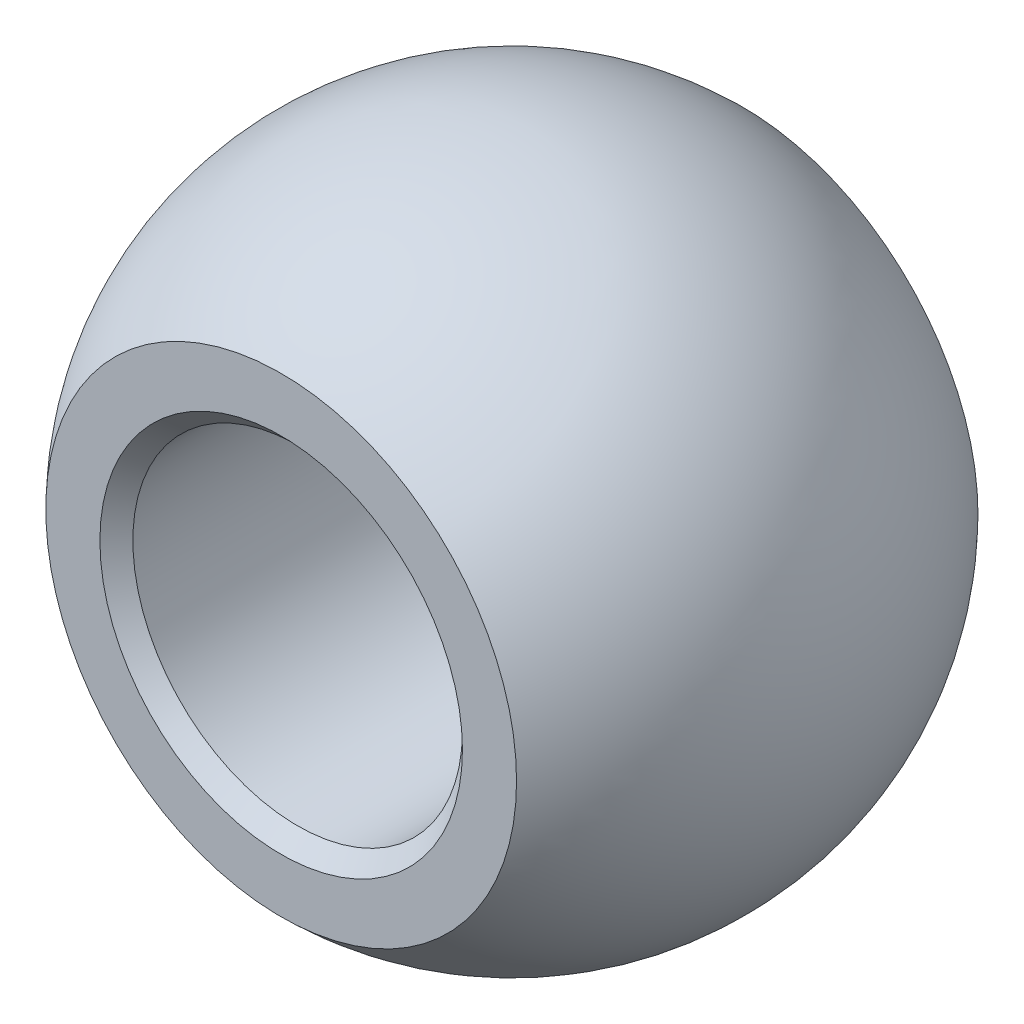
ISO-10303-21;
HEADER;
FILE_DESCRIPTION(('STEP AP214'),'2;1');
FILE_NAME('part.step','',(''),(''),'','','');
FILE_SCHEMA(('AUTOMOTIVE_DESIGN { 1 0 10303 214 1 1 1 1 }'));
ENDSEC;
DATA;
#1=APPLICATION_CONTEXT('core data for automotive mechanical design processes');
#2=APPLICATION_PROTOCOL_DEFINITION('international standard','automotive_design',2000,#1);
#3=PRODUCT_CONTEXT('',#1,'mechanical');
#4=PRODUCT('Part','Part','',(#3));
#5=PRODUCT_RELATED_PRODUCT_CATEGORY('part','',(#4));
#6=PRODUCT_DEFINITION_FORMATION('','',#4);
#7=PRODUCT_DEFINITION_CONTEXT('part definition',#1,'design');
#8=PRODUCT_DEFINITION('design','',#6,#7);
#9=PRODUCT_DEFINITION_SHAPE('','',#8);
#10=(LENGTH_UNIT() NAMED_UNIT(*) SI_UNIT(.MILLI.,.METRE.));
#11=(NAMED_UNIT(*) PLANE_ANGLE_UNIT() SI_UNIT($,.RADIAN.));
#12=(NAMED_UNIT(*) SI_UNIT($,.STERADIAN.) SOLID_ANGLE_UNIT());
#13=UNCERTAINTY_MEASURE_WITH_UNIT(LENGTH_MEASURE(1.E-05),#10,'distance_accuracy_value','');
#14=(GEOMETRIC_REPRESENTATION_CONTEXT(3) GLOBAL_UNCERTAINTY_ASSIGNED_CONTEXT((#13)) GLOBAL_UNIT_ASSIGNED_CONTEXT((#10,
#11,#12)) REPRESENTATION_CONTEXT('',''));
#15=CARTESIAN_POINT('',(0.,0.,0.));
#16=DIRECTION('',(0.,0.,1.));
#17=DIRECTION('',(1.,0.,0.));
#18=AXIS2_PLACEMENT_3D('',#15,#16,#17);
#19=CARTESIAN_POINT('',(0.,15.875,0.));
#20=DIRECTION('',(0.,-1.,0.));
#21=DIRECTION('',(1.,0.,0.));
#22=AXIS2_PLACEMENT_3D('',#19,#20,#21);
#23=SPHERICAL_SURFACE('',#22,7.9375);
#24=CARTESIAN_POINT('',(0.,15.875,0.));
#25=DIRECTION('',(0.,0.,1.));
#26=DIRECTION('',(1.,0.,0.));
#27=AXIS2_PLACEMENT_3D('',#24,#25,#26);
#28=SPHERICAL_SURFACE('',#27,7.9375);
#29=CARTESIAN_POINT('',(0.,15.875,-5.55625));
#30=DIRECTION('',(0.,0.,1.));
#31=DIRECTION('',(1.,0.,0.));
#32=AXIS2_PLACEMENT_3D('',#29,#30,#31);
#33=CIRCLE('',#32,5.66850881515589);
#34=CARTESIAN_POINT('',(5.66850881515589,15.875,-5.55625));
#35=VERTEX_POINT('',#34);
#36=EDGE_CURVE('E61',#35,#35,#33,.F.);
#37=ORIENTED_EDGE('',*,*,#36,.F.);
#38=EDGE_LOOP('',(#37));
#39=FACE_BOUND('',#38,.T.);
#40=CARTESIAN_POINT('',(0.,15.875,5.55625));
#41=DIRECTION('',(0.,0.,1.));
#42=DIRECTION('',(1.,0.,0.));
#43=AXIS2_PLACEMENT_3D('',#40,#41,#42);
#44=CIRCLE('',#43,5.66850881515589);
#45=CARTESIAN_POINT('',(5.66850881515589,15.875,5.55625));
#46=VERTEX_POINT('',#45);
#47=EDGE_CURVE('E64',#46,#46,#44,.F.);
#48=ORIENTED_EDGE('',*,*,#47,.T.);
#49=EDGE_LOOP('',(#48));
#50=FACE_BOUND('',#49,.T.);
#51=ADVANCED_FACE('F41',(#39,#50),#28,.T.);
#52=CARTESIAN_POINT('',(0.,15.875,-7.9375));
#53=DIRECTION('',(0.,0.,1.));
#54=DIRECTION('',(1.,0.,0.));
#55=AXIS2_PLACEMENT_3D('',#52,#53,#54);
#56=CYLINDRICAL_SURFACE('',#55,3.96875);
#57=CARTESIAN_POINT('',(0.,15.875,-5.15937500000001));
#58=DIRECTION('',(0.,0.,1.));
#59=DIRECTION('',(1.,0.,0.));
#60=AXIS2_PLACEMENT_3D('',#57,#58,#59);
#61=CIRCLE('',#60,3.96875);
#62=CARTESIAN_POINT('',(3.96875,15.875,-5.15937500000001));
#63=VERTEX_POINT('',#62);
#64=EDGE_CURVE('E52',#63,#63,#61,.F.);
#65=ORIENTED_EDGE('',*,*,#64,.T.);
#66=EDGE_LOOP('',(#65));
#67=FACE_BOUND('',#66,.T.);
#68=CARTESIAN_POINT('',(0.,15.875,5.159375));
#69=DIRECTION('',(0.,0.,1.));
#70=DIRECTION('',(1.,0.,0.));
#71=AXIS2_PLACEMENT_3D('',#68,#69,#70);
#72=CIRCLE('',#71,3.96875);
#73=CARTESIAN_POINT('',(3.96875,15.875,5.159375));
#74=VERTEX_POINT('',#73);
#75=EDGE_CURVE('E56',#74,#74,#72,.T.);
#76=ORIENTED_EDGE('',*,*,#75,.T.);
#77=EDGE_LOOP('',(#76));
#78=FACE_BOUND('',#77,.T.);
#79=ADVANCED_FACE('F79',(#67,#78),#56,.F.);
#80=CARTESIAN_POINT('',(0.,0.,-5.55625));
#81=DIRECTION('',(0.,0.,1.));
#82=DIRECTION('',(1.,0.,0.));
#83=AXIS2_PLACEMENT_3D('',#80,#81,#82);
#84=PLANE('',#83);
#85=CARTESIAN_POINT('',(0.,15.875,-5.55625));
#86=DIRECTION('',(0.,0.,1.));
#87=DIRECTION('',(1.,0.,0.));
#88=AXIS2_PLACEMENT_3D('',#85,#86,#87);
#89=CIRCLE('',#88,4.365625);
#90=CARTESIAN_POINT('',(4.365625,15.875,-5.55625));
#91=VERTEX_POINT('',#90);
#92=EDGE_CURVE('E48',#91,#91,#89,.T.);
#93=ORIENTED_EDGE('',*,*,#92,.T.);
#94=EDGE_LOOP('',(#93));
#95=FACE_BOUND('',#94,.T.);
#96=ORIENTED_EDGE('',*,*,#36,.T.);
#97=EDGE_LOOP('',(#96));
#98=FACE_BOUND('',#97,.T.);
#99=ADVANCED_FACE('F72',(#95,#98),#84,.F.);
#100=CARTESIAN_POINT('',(0.,0.,5.55625));
#101=DIRECTION('',(0.,0.,1.));
#102=DIRECTION('',(1.,0.,0.));
#103=AXIS2_PLACEMENT_3D('',#100,#101,#102);
#104=PLANE('',#103);
#105=CARTESIAN_POINT('',(0.,15.875,5.55625));
#106=DIRECTION('',(0.,0.,1.));
#107=DIRECTION('',(1.,0.,0.));
#108=AXIS2_PLACEMENT_3D('',#105,#106,#107);
#109=CIRCLE('',#108,4.365625);
#110=CARTESIAN_POINT('',(4.365625,15.875,5.55625));
#111=VERTEX_POINT('',#110);
#112=EDGE_CURVE('E10',#111,#111,#109,.F.);
#113=ORIENTED_EDGE('',*,*,#112,.T.);
#114=EDGE_LOOP('',(#113));
#115=FACE_BOUND('',#114,.T.);
#116=ORIENTED_EDGE('',*,*,#47,.F.);
#117=EDGE_LOOP('',(#116));
#118=FACE_BOUND('',#117,.T.);
#119=ADVANCED_FACE('F69',(#115,#118),#104,.T.);
#120=CARTESIAN_POINT('',(0.,15.875,-5.15937500000001));
#121=DIRECTION('',(0.,0.,-1.));
#122=DIRECTION('',(-1.,0.,0.));
#123=AXIS2_PLACEMENT_3D('',#120,#121,#122);
#124=CONICAL_SURFACE('',#123,3.96875,0.785398163397451);
#125=ORIENTED_EDGE('',*,*,#92,.F.);
#126=EDGE_LOOP('',(#125));
#127=FACE_BOUND('',#126,.T.);
#128=ORIENTED_EDGE('',*,*,#64,.F.);
#129=EDGE_LOOP('',(#128));
#130=FACE_BOUND('',#129,.T.);
#131=ADVANCED_FACE('F71',(#127,#130),#124,.F.);
#132=CARTESIAN_POINT('',(0.,15.875,5.55625));
#133=DIRECTION('',(0.,0.,1.));
#134=DIRECTION('',(1.,0.,0.));
#135=AXIS2_PLACEMENT_3D('',#132,#133,#134);
#136=CONICAL_SURFACE('',#135,4.365625,0.785398163397446);
#137=ORIENTED_EDGE('',*,*,#75,.F.);
#138=EDGE_LOOP('',(#137));
#139=FACE_BOUND('',#138,.T.);
#140=ORIENTED_EDGE('',*,*,#112,.F.);
#141=EDGE_LOOP('',(#140));
#142=FACE_BOUND('',#141,.T.);
#143=ADVANCED_FACE('F43',(#139,#142),#136,.F.);
#144=CLOSED_SHELL('',(#51,#79,#99,#119,#131,#143));
#145=MANIFOLD_SOLID_BREP('B2',#144);
#146=ADVANCED_BREP_SHAPE_REPRESENTATION('',(#18,#145),#14);
#147=SHAPE_DEFINITION_REPRESENTATION(#9,#146);
ENDSEC;
END-ISO-10303-21;
